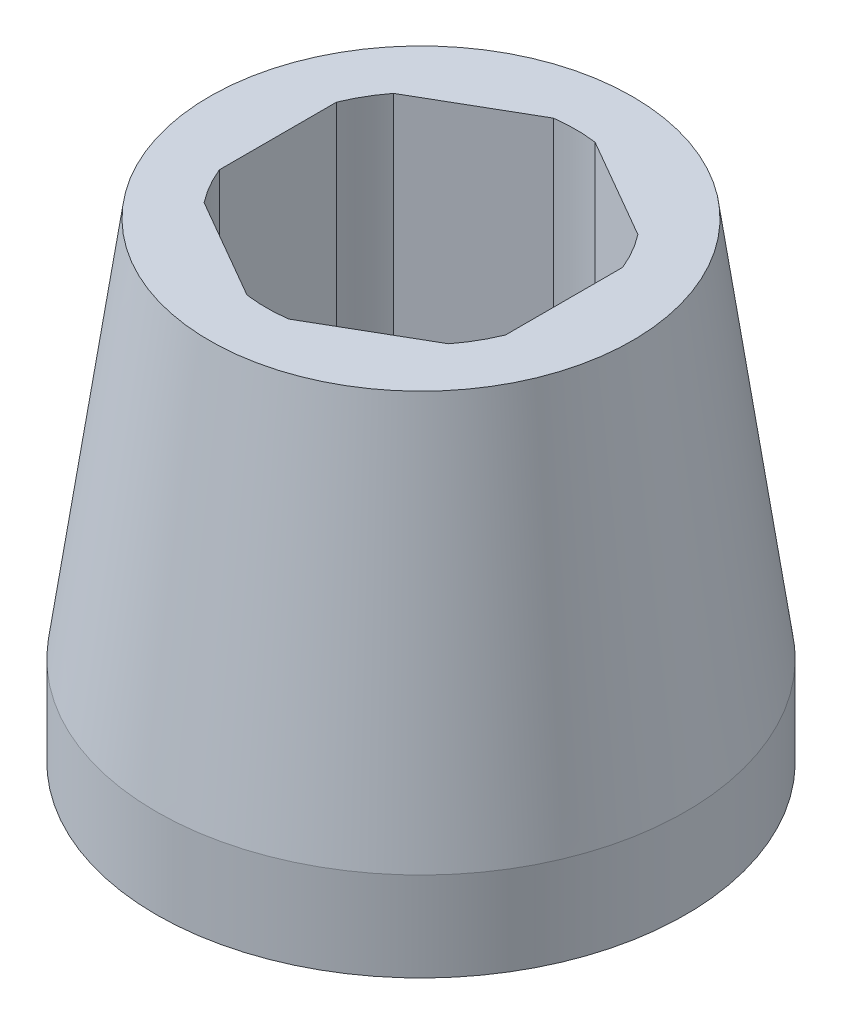
ISO-10303-21;
HEADER;
FILE_DESCRIPTION(('STEP AP214'),'2;1');
FILE_NAME('part.step','',(''),(''),'','','');
FILE_SCHEMA(('AUTOMOTIVE_DESIGN { 1 0 10303 214 1 1 1 1 }'));
ENDSEC;
DATA;
#1=APPLICATION_CONTEXT('core data for automotive mechanical design processes');
#2=APPLICATION_PROTOCOL_DEFINITION('international standard','automotive_design',2000,#1);
#3=PRODUCT_CONTEXT('',#1,'mechanical');
#4=PRODUCT('Part','Part','',(#3));
#5=PRODUCT_RELATED_PRODUCT_CATEGORY('part','',(#4));
#6=PRODUCT_DEFINITION_FORMATION('','',#4);
#7=PRODUCT_DEFINITION_CONTEXT('part definition',#1,'design');
#8=PRODUCT_DEFINITION('design','',#6,#7);
#9=PRODUCT_DEFINITION_SHAPE('','',#8);
#10=(LENGTH_UNIT() NAMED_UNIT(*) SI_UNIT(.MILLI.,.METRE.));
#11=(NAMED_UNIT(*) PLANE_ANGLE_UNIT() SI_UNIT($,.RADIAN.));
#12=(NAMED_UNIT(*) SI_UNIT($,.STERADIAN.) SOLID_ANGLE_UNIT());
#13=UNCERTAINTY_MEASURE_WITH_UNIT(LENGTH_MEASURE(1.E-05),#10,'distance_accuracy_value','');
#14=(GEOMETRIC_REPRESENTATION_CONTEXT(3) GLOBAL_UNCERTAINTY_ASSIGNED_CONTEXT((#13)) GLOBAL_UNIT_ASSIGNED_CONTEXT((#10,
#11,#12)) REPRESENTATION_CONTEXT('',''));
#15=CARTESIAN_POINT('',(0.,0.,0.));
#16=DIRECTION('',(0.,0.,1.));
#17=DIRECTION('',(1.,0.,0.));
#18=AXIS2_PLACEMENT_3D('',#15,#16,#17);
#19=CARTESIAN_POINT('',(0.,0.,0.));
#20=DIRECTION('',(0.,-1.,0.));
#21=DIRECTION('',(0.,0.,-1.));
#22=AXIS2_PLACEMENT_3D('',#19,#20,#21);
#23=CYLINDRICAL_SURFACE('',#22,5.2);
#24=CARTESIAN_POINT('',(0.,15.829,0.));
#25=DIRECTION('',(0.,-1.,0.));
#26=DIRECTION('',(0.,0.,-1.));
#27=AXIS2_PLACEMENT_3D('',#24,#25,#26);
#28=CIRCLE('',#27,5.2);
#29=CARTESIAN_POINT('',(0.700412137687176,15.829,5.15261320471278));
#30=VERTEX_POINT('',#29);
#31=CARTESIAN_POINT('',(-0.700412137687167,15.829,5.15261320471278));
#32=VERTEX_POINT('',#31);
#33=EDGE_CURVE('E153',#30,#32,#28,.T.);
#34=ORIENTED_EDGE('',*,*,#33,.F.);
#35=DIRECTION('',(0.,-1.,0.));
#36=VECTOR('',#35,1.);
#37=CARTESIAN_POINT('',(0.700412137687176,19.7874758746265,5.15261320471278));
#38=LINE('',#37,#36);
#39=CARTESIAN_POINT('',(0.700412137687176,4.953,5.15261320471278));
#40=VERTEX_POINT('',#39);
#41=EDGE_CURVE('E140',#30,#40,#38,.T.);
#42=ORIENTED_EDGE('',*,*,#41,.T.);
#43=CARTESIAN_POINT('',(0.,4.953,0.));
#44=DIRECTION('',(0.,-1.,0.));
#45=DIRECTION('',(0.,0.,-1.));
#46=AXIS2_PLACEMENT_3D('',#43,#44,#45);
#47=CIRCLE('',#46,5.2);
#48=CARTESIAN_POINT('',(-0.700412137687167,4.953,5.15261320471278));
#49=VERTEX_POINT('',#48);
#50=EDGE_CURVE('E151',#40,#49,#47,.T.);
#51=ORIENTED_EDGE('',*,*,#50,.T.);
#52=DIRECTION('',(0.,-1.,0.));
#53=VECTOR('',#52,1.);
#54=CARTESIAN_POINT('',(-0.700412137687167,19.7874758746265,5.15261320471278));
#55=LINE('',#54,#53);
#56=EDGE_CURVE('E229',#32,#49,#55,.T.);
#57=ORIENTED_EDGE('',*,*,#56,.F.);
#58=EDGE_LOOP('',(#34,#42,#51,#57));
#59=FACE_BOUND('',#58,.T.);
#60=ADVANCED_FACE('F49',(#59),#23,.F.);
#61=CARTESIAN_POINT('',(4.8125,4.953,1.96973189800033));
#62=VERTEX_POINT('',#61);
#63=CARTESIAN_POINT('',(4.11208786231283,4.953,3.18288130671244));
#64=VERTEX_POINT('',#63);
#65=EDGE_CURVE('E159',#62,#64,#47,.T.);
#66=ORIENTED_EDGE('',*,*,#65,.T.);
#67=DIRECTION('',(0.,-1.,0.));
#68=VECTOR('',#67,1.);
#69=CARTESIAN_POINT('',(4.11208786231283,19.7874758746265,3.18288130671244));
#70=LINE('',#69,#68);
#71=CARTESIAN_POINT('',(4.11208786231283,15.829,3.18288130671244));
#72=VERTEX_POINT('',#71);
#73=EDGE_CURVE('E143',#72,#64,#70,.T.);
#74=ORIENTED_EDGE('',*,*,#73,.F.);
#75=CARTESIAN_POINT('',(4.8125,15.829,1.96973189800033));
#76=VERTEX_POINT('',#75);
#77=EDGE_CURVE('E248',#76,#72,#28,.T.);
#78=ORIENTED_EDGE('',*,*,#77,.F.);
#79=DIRECTION('',(0.,-1.,0.));
#80=VECTOR('',#79,1.);
#81=CARTESIAN_POINT('',(4.8125,19.7874758746265,1.96973189800033));
#82=LINE('',#81,#80);
#83=EDGE_CURVE('E202',#76,#62,#82,.T.);
#84=ORIENTED_EDGE('',*,*,#83,.T.);
#85=EDGE_LOOP('',(#66,#74,#78,#84));
#86=FACE_BOUND('',#85,.T.);
#87=ADVANCED_FACE('F286',(#86),#23,.F.);
#88=CARTESIAN_POINT('',(4.11208786231283,4.953,-3.18288130671244));
#89=VERTEX_POINT('',#88);
#90=CARTESIAN_POINT('',(4.8125,4.953,-1.96973189800033));
#91=VERTEX_POINT('',#90);
#92=EDGE_CURVE('E163',#89,#91,#47,.T.);
#93=ORIENTED_EDGE('',*,*,#92,.T.);
#94=DIRECTION('',(0.,-1.,0.));
#95=VECTOR('',#94,1.);
#96=CARTESIAN_POINT('',(4.8125,19.7874758746265,-1.96973189800033));
#97=LINE('',#96,#95);
#98=CARTESIAN_POINT('',(4.8125,15.829,-1.96973189800033));
#99=VERTEX_POINT('',#98);
#100=EDGE_CURVE('E193',#99,#91,#97,.T.);
#101=ORIENTED_EDGE('',*,*,#100,.F.);
#102=CARTESIAN_POINT('',(4.11208786231283,15.829,-3.18288130671244));
#103=VERTEX_POINT('',#102);
#104=EDGE_CURVE('E250',#103,#99,#28,.T.);
#105=ORIENTED_EDGE('',*,*,#104,.F.);
#106=DIRECTION('',(0.,-1.,0.));
#107=VECTOR('',#106,1.);
#108=CARTESIAN_POINT('',(4.11208786231283,19.7874758746265,-3.18288130671244));
#109=LINE('',#108,#107);
#110=EDGE_CURVE('E195',#103,#89,#109,.T.);
#111=ORIENTED_EDGE('',*,*,#110,.T.);
#112=EDGE_LOOP('',(#93,#101,#105,#111));
#113=FACE_BOUND('',#112,.T.);
#114=ADVANCED_FACE('F191',(#113),#23,.F.);
#115=CARTESIAN_POINT('',(-0.700412137687172,4.953,-5.15261320471278));
#116=VERTEX_POINT('',#115);
#117=CARTESIAN_POINT('',(0.700412137687175,4.953,-5.15261320471278));
#118=VERTEX_POINT('',#117);
#119=EDGE_CURVE('E176',#116,#118,#47,.T.);
#120=ORIENTED_EDGE('',*,*,#119,.T.);
#121=DIRECTION('',(0.,-1.,0.));
#122=VECTOR('',#121,1.);
#123=CARTESIAN_POINT('',(0.700412137687175,19.7874758746265,-5.15261320471278));
#124=LINE('',#123,#122);
#125=CARTESIAN_POINT('',(0.700412137687175,15.829,-5.15261320471278));
#126=VERTEX_POINT('',#125);
#127=EDGE_CURVE('E208',#126,#118,#124,.T.);
#128=ORIENTED_EDGE('',*,*,#127,.F.);
#129=CARTESIAN_POINT('',(-0.700412137687172,15.829,-5.15261320471278));
#130=VERTEX_POINT('',#129);
#131=EDGE_CURVE('E252',#130,#126,#28,.T.);
#132=ORIENTED_EDGE('',*,*,#131,.F.);
#133=DIRECTION('',(0.,-1.,0.));
#134=VECTOR('',#133,1.);
#135=CARTESIAN_POINT('',(-0.700412137687172,19.7874758746265,-5.15261320471278));
#136=LINE('',#135,#134);
#137=EDGE_CURVE('E218',#130,#116,#136,.T.);
#138=ORIENTED_EDGE('',*,*,#137,.T.);
#139=EDGE_LOOP('',(#120,#128,#132,#138));
#140=FACE_BOUND('',#139,.T.);
#141=ADVANCED_FACE('F303',(#140),#23,.F.);
#142=CARTESIAN_POINT('',(-4.8125,4.953,-1.96973189800034));
#143=VERTEX_POINT('',#142);
#144=CARTESIAN_POINT('',(-4.11208786231283,4.953,-3.18288130671244));
#145=VERTEX_POINT('',#144);
#146=EDGE_CURVE('E170',#143,#145,#47,.T.);
#147=ORIENTED_EDGE('',*,*,#146,.T.);
#148=DIRECTION('',(0.,-1.,0.));
#149=VECTOR('',#148,1.);
#150=CARTESIAN_POINT('',(-4.11208786231283,19.7874758746265,-3.18288130671244));
#151=LINE('',#150,#149);
#152=CARTESIAN_POINT('',(-4.11208786231283,15.829,-3.18288130671244));
#153=VERTEX_POINT('',#152);
#154=EDGE_CURVE('E213',#153,#145,#151,.T.);
#155=ORIENTED_EDGE('',*,*,#154,.F.);
#156=CARTESIAN_POINT('',(-4.8125,15.829,-1.96973189800034));
#157=VERTEX_POINT('',#156);
#158=EDGE_CURVE('E165',#157,#153,#28,.T.);
#159=ORIENTED_EDGE('',*,*,#158,.F.);
#160=DIRECTION('',(0.,-1.,0.));
#161=VECTOR('',#160,1.);
#162=CARTESIAN_POINT('',(-4.8125,19.7874758746265,-1.96973189800034));
#163=LINE('',#162,#161);
#164=EDGE_CURVE('E226',#157,#143,#163,.T.);
#165=ORIENTED_EDGE('',*,*,#164,.T.);
#166=EDGE_LOOP('',(#147,#155,#159,#165));
#167=FACE_BOUND('',#166,.T.);
#168=ADVANCED_FACE('F261',(#167),#23,.F.);
#169=CARTESIAN_POINT('',(-4.11208786231283,4.953,3.18288130671244));
#170=VERTEX_POINT('',#169);
#171=CARTESIAN_POINT('',(-4.8125,4.953,1.96973189800034));
#172=VERTEX_POINT('',#171);
#173=EDGE_CURVE('E162',#170,#172,#47,.T.);
#174=ORIENTED_EDGE('',*,*,#173,.T.);
#175=DIRECTION('',(0.,-1.,0.));
#176=VECTOR('',#175,1.);
#177=CARTESIAN_POINT('',(-4.8125,19.7874758746265,1.96973189800034));
#178=LINE('',#177,#176);
#179=CARTESIAN_POINT('',(-4.8125,15.829,1.96973189800034));
#180=VERTEX_POINT('',#179);
#181=EDGE_CURVE('E221',#180,#172,#178,.T.);
#182=ORIENTED_EDGE('',*,*,#181,.F.);
#183=CARTESIAN_POINT('',(-4.11208786231283,15.829,3.18288130671244));
#184=VERTEX_POINT('',#183);
#185=EDGE_CURVE('E160',#184,#180,#28,.T.);
#186=ORIENTED_EDGE('',*,*,#185,.F.);
#187=DIRECTION('',(0.,-1.,0.));
#188=VECTOR('',#187,1.);
#189=CARTESIAN_POINT('',(-4.11208786231283,19.7874758746265,3.18288130671244));
#190=LINE('',#189,#188);
#191=EDGE_CURVE('E233',#184,#170,#190,.T.);
#192=ORIENTED_EDGE('',*,*,#191,.T.);
#193=EDGE_LOOP('',(#174,#182,#186,#192));
#194=FACE_BOUND('',#193,.T.);
#195=ADVANCED_FACE('F269',(#194),#23,.F.);
#196=CARTESIAN_POINT('',(8.9,0.,0.));
#197=DIRECTION('',(0.,-1.,0.));
#198=DIRECTION('',(0.,0.,-1.));
#199=AXIS2_PLACEMENT_3D('',#196,#197,#198);
#200=PLANE('',#199);
#201=CARTESIAN_POINT('',(0.,0.,0.));
#202=DIRECTION('',(0.,-1.,0.));
#203=DIRECTION('',(0.,0.,-1.));
#204=AXIS2_PLACEMENT_3D('',#201,#202,#203);
#205=CIRCLE('',#204,7.55);
#206=CARTESIAN_POINT('',(0.,0.,-7.55));
#207=VERTEX_POINT('',#206);
#208=EDGE_CURVE('E11',#207,#207,#205,.F.);
#209=ORIENTED_EDGE('',*,*,#208,.T.);
#210=EDGE_LOOP('',(#209));
#211=FACE_BOUND('',#210,.T.);
#212=CARTESIAN_POINT('',(0.,0.,0.));
#213=DIRECTION('',(0.,-1.,0.));
#214=DIRECTION('',(0.,0.,-1.));
#215=AXIS2_PLACEMENT_3D('',#212,#213,#214);
#216=CIRCLE('',#215,8.9);
#217=CARTESIAN_POINT('',(0.,0.,-8.9));
#218=VERTEX_POINT('',#217);
#219=EDGE_CURVE('E236',#218,#218,#216,.T.);
#220=ORIENTED_EDGE('',*,*,#219,.T.);
#221=EDGE_LOOP('',(#220));
#222=FACE_BOUND('',#221,.T.);
#223=ADVANCED_FACE('F295',(#211,#222),#200,.T.);
#224=CARTESIAN_POINT('',(0.,0.,0.));
#225=DIRECTION('',(0.,-1.,0.));
#226=DIRECTION('',(0.,0.,-1.));
#227=AXIS2_PLACEMENT_3D('',#224,#225,#226);
#228=CYLINDRICAL_SURFACE('',#227,6.8);
#229=CARTESIAN_POINT('',(0.,0.750000000000002,0.));
#230=DIRECTION('',(0.,-1.,0.));
#231=DIRECTION('',(0.,0.,-1.));
#232=AXIS2_PLACEMENT_3D('',#229,#230,#231);
#233=CIRCLE('',#232,6.8);
#234=CARTESIAN_POINT('',(0.,0.750000000000002,-6.8));
#235=VERTEX_POINT('',#234);
#236=EDGE_CURVE('E58',#235,#235,#233,.T.);
#237=ORIENTED_EDGE('',*,*,#236,.T.);
#238=EDGE_LOOP('',(#237));
#239=FACE_BOUND('',#238,.T.);
#240=CARTESIAN_POINT('',(0.,4.953,0.));
#241=DIRECTION('',(0.,-1.,0.));
#242=DIRECTION('',(0.,0.,-1.));
#243=AXIS2_PLACEMENT_3D('',#240,#241,#242);
#244=CIRCLE('',#243,6.8);
#245=CARTESIAN_POINT('',(0.,4.953,-6.8));
#246=VERTEX_POINT('',#245);
#247=EDGE_CURVE('E169',#246,#246,#244,.T.);
#248=ORIENTED_EDGE('',*,*,#247,.F.);
#249=EDGE_LOOP('',(#248));
#250=FACE_BOUND('',#249,.T.);
#251=ADVANCED_FACE('F301',(#239,#250),#228,.F.);
#252=CARTESIAN_POINT('',(6.8,4.953,0.));
#253=DIRECTION('',(0.,-1.,0.));
#254=DIRECTION('',(0.,0.,-1.));
#255=AXIS2_PLACEMENT_3D('',#252,#253,#254);
#256=PLANE('',#255);
#257=ORIENTED_EDGE('',*,*,#247,.T.);
#258=EDGE_LOOP('',(#257));
#259=FACE_BOUND('',#258,.T.);
#260=ORIENTED_EDGE('',*,*,#173,.F.);
#261=DIRECTION('',(-0.866025403784438,0.,-0.5));
#262=VECTOR('',#261,1.);
#263=CARTESIAN_POINT('',(-2.40625,4.953,4.16774725571261));
#264=LINE('',#263,#262);
#265=EDGE_CURVE('E158',#49,#170,#264,.T.);
#266=ORIENTED_EDGE('',*,*,#265,.F.);
#267=ORIENTED_EDGE('',*,*,#50,.F.);
#268=DIRECTION('',(-0.866025403784438,0.,0.5));
#269=VECTOR('',#268,1.);
#270=CARTESIAN_POINT('',(2.40625,4.953,4.16774725571261));
#271=LINE('',#270,#269);
#272=EDGE_CURVE('E137',#64,#40,#271,.T.);
#273=ORIENTED_EDGE('',*,*,#272,.F.);
#274=ORIENTED_EDGE('',*,*,#65,.F.);
#275=DIRECTION('',(0.,0.,1.));
#276=VECTOR('',#275,1.);
#277=CARTESIAN_POINT('',(4.8125,4.953,0.));
#278=LINE('',#277,#276);
#279=EDGE_CURVE('E199',#91,#62,#278,.T.);
#280=ORIENTED_EDGE('',*,*,#279,.F.);
#281=ORIENTED_EDGE('',*,*,#92,.F.);
#282=DIRECTION('',(0.866025403784439,0.,0.5));
#283=VECTOR('',#282,1.);
#284=CARTESIAN_POINT('',(2.40625,4.953,-4.16774725571261));
#285=LINE('',#284,#283);
#286=EDGE_CURVE('E198',#118,#89,#285,.T.);
#287=ORIENTED_EDGE('',*,*,#286,.F.);
#288=ORIENTED_EDGE('',*,*,#119,.F.);
#289=DIRECTION('',(0.866025403784439,0.,-0.5));
#290=VECTOR('',#289,1.);
#291=CARTESIAN_POINT('',(-2.40625,4.953,-4.16774725571261));
#292=LINE('',#291,#290);
#293=EDGE_CURVE('E216',#145,#116,#292,.T.);
#294=ORIENTED_EDGE('',*,*,#293,.F.);
#295=ORIENTED_EDGE('',*,*,#146,.F.);
#296=DIRECTION('',(0.,0.,-1.));
#297=VECTOR('',#296,1.);
#298=CARTESIAN_POINT('',(-4.8125,4.953,0.));
#299=LINE('',#298,#297);
#300=EDGE_CURVE('E224',#172,#143,#299,.T.);
#301=ORIENTED_EDGE('',*,*,#300,.F.);
#302=EDGE_LOOP('',(#260,#266,#267,#273,#274,#280,#281,#287,#288,#294,#295,#301));
#303=FACE_BOUND('',#302,.T.);
#304=ADVANCED_FACE('F157',(#259,#303),#256,.T.);
#305=CARTESIAN_POINT('',(5.2,15.829,0.));
#306=DIRECTION('',(0.,1.,0.));
#307=DIRECTION('',(0.,0.,1.));
#308=AXIS2_PLACEMENT_3D('',#305,#306,#307);
#309=PLANE('',#308);
#310=ORIENTED_EDGE('',*,*,#185,.T.);
#311=DIRECTION('',(0.,0.,-1.));
#312=VECTOR('',#311,1.);
#313=CARTESIAN_POINT('',(-4.8125,15.829,0.));
#314=LINE('',#313,#312);
#315=EDGE_CURVE('E227',#180,#157,#314,.T.);
#316=ORIENTED_EDGE('',*,*,#315,.T.);
#317=ORIENTED_EDGE('',*,*,#158,.T.);
#318=DIRECTION('',(0.866025403784439,0.,-0.5));
#319=VECTOR('',#318,1.);
#320=CARTESIAN_POINT('',(-2.40625,15.829,-4.16774725571261));
#321=LINE('',#320,#319);
#322=EDGE_CURVE('E219',#153,#130,#321,.T.);
#323=ORIENTED_EDGE('',*,*,#322,.T.);
#324=ORIENTED_EDGE('',*,*,#131,.T.);
#325=DIRECTION('',(0.866025403784439,0.,0.5));
#326=VECTOR('',#325,1.);
#327=CARTESIAN_POINT('',(2.40625,15.829,-4.16774725571261));
#328=LINE('',#327,#326);
#329=EDGE_CURVE('E211',#126,#103,#328,.T.);
#330=ORIENTED_EDGE('',*,*,#329,.T.);
#331=ORIENTED_EDGE('',*,*,#104,.T.);
#332=DIRECTION('',(0.,0.,1.));
#333=VECTOR('',#332,1.);
#334=CARTESIAN_POINT('',(4.8125,15.829,0.));
#335=LINE('',#334,#333);
#336=EDGE_CURVE('E71',#99,#76,#335,.T.);
#337=ORIENTED_EDGE('',*,*,#336,.T.);
#338=ORIENTED_EDGE('',*,*,#77,.T.);
#339=DIRECTION('',(-0.866025403784439,0.,0.5));
#340=VECTOR('',#339,1.);
#341=CARTESIAN_POINT('',(2.40625,15.829,4.16774725571261));
#342=LINE('',#341,#340);
#343=EDGE_CURVE('E65',#72,#30,#342,.T.);
#344=ORIENTED_EDGE('',*,*,#343,.T.);
#345=ORIENTED_EDGE('',*,*,#33,.T.);
#346=DIRECTION('',(-0.866025403784439,0.,-0.5));
#347=VECTOR('',#346,1.);
#348=CARTESIAN_POINT('',(-2.40625,15.829,4.16774725571261));
#349=LINE('',#348,#347);
#350=EDGE_CURVE('E234',#32,#184,#349,.T.);
#351=ORIENTED_EDGE('',*,*,#350,.T.);
#352=EDGE_LOOP('',(#310,#316,#317,#323,#324,#330,#331,#337,#338,#344,#345,#351));
#353=FACE_BOUND('',#352,.T.);
#354=CARTESIAN_POINT('',(0.,15.829,0.));
#355=DIRECTION('',(0.,-1.,0.));
#356=DIRECTION('',(0.,0.,-1.));
#357=AXIS2_PLACEMENT_3D('',#354,#355,#356);
#358=CIRCLE('',#357,7.112);
#359=CARTESIAN_POINT('',(0.,15.829,-7.112));
#360=VERTEX_POINT('',#359);
#361=EDGE_CURVE('E244',#360,#360,#358,.T.);
#362=ORIENTED_EDGE('',*,*,#361,.F.);
#363=EDGE_LOOP('',(#362));
#364=FACE_BOUND('',#363,.T.);
#365=ADVANCED_FACE('F257',(#353,#364),#309,.T.);
#366=CARTESIAN_POINT('',(0.,3.,0.));
#367=DIRECTION('',(0.,-1.,0.));
#368=DIRECTION('',(0.,0.,-1.));
#369=AXIS2_PLACEMENT_3D('',#366,#367,#368);
#370=CONICAL_SURFACE('',#369,8.9,0.138479701572066);
#371=ORIENTED_EDGE('',*,*,#361,.T.);
#372=EDGE_LOOP('',(#371));
#373=FACE_BOUND('',#372,.T.);
#374=CARTESIAN_POINT('',(0.,3.,0.));
#375=DIRECTION('',(0.,-1.,0.));
#376=DIRECTION('',(0.,0.,-1.));
#377=AXIS2_PLACEMENT_3D('',#374,#375,#376);
#378=CIRCLE('',#377,8.9);
#379=CARTESIAN_POINT('',(0.,3.,-8.9));
#380=VERTEX_POINT('',#379);
#381=EDGE_CURVE('E241',#380,#380,#378,.T.);
#382=ORIENTED_EDGE('',*,*,#381,.F.);
#383=EDGE_LOOP('',(#382));
#384=FACE_BOUND('',#383,.T.);
#385=ADVANCED_FACE('F282',(#373,#384),#370,.T.);
#386=CARTESIAN_POINT('',(0.,0.,0.));
#387=DIRECTION('',(0.,-1.,0.));
#388=DIRECTION('',(0.,0.,-1.));
#389=AXIS2_PLACEMENT_3D('',#386,#387,#388);
#390=CYLINDRICAL_SURFACE('',#389,8.9);
#391=ORIENTED_EDGE('',*,*,#381,.T.);
#392=EDGE_LOOP('',(#391));
#393=FACE_BOUND('',#392,.T.);
#394=ORIENTED_EDGE('',*,*,#219,.F.);
#395=EDGE_LOOP('',(#394));
#396=FACE_BOUND('',#395,.T.);
#397=ADVANCED_FACE('F274',(#393,#396),#390,.T.);
#398=CARTESIAN_POINT('',(-2.40625,19.7874758746265,4.16774725571261));
#399=DIRECTION('',(-0.5,0.,0.866025403784438));
#400=DIRECTION('',(0.866025403784439,0.,0.5));
#401=AXIS2_PLACEMENT_3D('',#398,#399,#400);
#402=PLANE('',#401);
#403=ORIENTED_EDGE('',*,*,#350,.F.);
#404=ORIENTED_EDGE('',*,*,#56,.T.);
#405=ORIENTED_EDGE('',*,*,#265,.T.);
#406=ORIENTED_EDGE('',*,*,#191,.F.);
#407=EDGE_LOOP('',(#403,#404,#405,#406));
#408=FACE_BOUND('',#407,.T.);
#409=ADVANCED_FACE('F272',(#408),#402,.F.);
#410=CARTESIAN_POINT('',(-4.8125,19.7874758746265,0.));
#411=DIRECTION('',(-1.,0.,0.));
#412=DIRECTION('',(0.,0.,1.));
#413=AXIS2_PLACEMENT_3D('',#410,#411,#412);
#414=PLANE('',#413);
#415=ORIENTED_EDGE('',*,*,#315,.F.);
#416=ORIENTED_EDGE('',*,*,#181,.T.);
#417=ORIENTED_EDGE('',*,*,#300,.T.);
#418=ORIENTED_EDGE('',*,*,#164,.F.);
#419=EDGE_LOOP('',(#415,#416,#417,#418));
#420=FACE_BOUND('',#419,.T.);
#421=ADVANCED_FACE('F267',(#420),#414,.F.);
#422=CARTESIAN_POINT('',(-2.40625,19.7874758746265,-4.16774725571261));
#423=DIRECTION('',(-0.5,0.,-0.866025403784439));
#424=DIRECTION('',(-0.866025403784439,0.,0.5));
#425=AXIS2_PLACEMENT_3D('',#422,#423,#424);
#426=PLANE('',#425);
#427=ORIENTED_EDGE('',*,*,#322,.F.);
#428=ORIENTED_EDGE('',*,*,#154,.T.);
#429=ORIENTED_EDGE('',*,*,#293,.T.);
#430=ORIENTED_EDGE('',*,*,#137,.F.);
#431=EDGE_LOOP('',(#427,#428,#429,#430));
#432=FACE_BOUND('',#431,.T.);
#433=ADVANCED_FACE('F264',(#432),#426,.F.);
#434=CARTESIAN_POINT('',(2.40625,19.7874758746265,-4.16774725571261));
#435=DIRECTION('',(0.5,0.,-0.866025403784439));
#436=DIRECTION('',(-0.866025403784439,0.,-0.5));
#437=AXIS2_PLACEMENT_3D('',#434,#435,#436);
#438=PLANE('',#437);
#439=ORIENTED_EDGE('',*,*,#329,.F.);
#440=ORIENTED_EDGE('',*,*,#127,.T.);
#441=ORIENTED_EDGE('',*,*,#286,.T.);
#442=ORIENTED_EDGE('',*,*,#110,.F.);
#443=EDGE_LOOP('',(#439,#440,#441,#442));
#444=FACE_BOUND('',#443,.T.);
#445=ADVANCED_FACE('F392',(#444),#438,.F.);
#446=CARTESIAN_POINT('',(4.8125,19.7874758746265,0.));
#447=DIRECTION('',(1.,0.,0.));
#448=DIRECTION('',(0.,0.,-1.));
#449=AXIS2_PLACEMENT_3D('',#446,#447,#448);
#450=PLANE('',#449);
#451=ORIENTED_EDGE('',*,*,#336,.F.);
#452=ORIENTED_EDGE('',*,*,#100,.T.);
#453=ORIENTED_EDGE('',*,*,#279,.T.);
#454=ORIENTED_EDGE('',*,*,#83,.F.);
#455=EDGE_LOOP('',(#451,#452,#453,#454));
#456=FACE_BOUND('',#455,.T.);
#457=ADVANCED_FACE('F401',(#456),#450,.F.);
#458=CARTESIAN_POINT('',(2.40625,19.7874758746265,4.16774725571261));
#459=DIRECTION('',(0.5,0.,0.866025403784438));
#460=DIRECTION('',(0.866025403784439,0.,-0.5));
#461=AXIS2_PLACEMENT_3D('',#458,#459,#460);
#462=PLANE('',#461);
#463=ORIENTED_EDGE('',*,*,#343,.F.);
#464=ORIENTED_EDGE('',*,*,#73,.T.);
#465=ORIENTED_EDGE('',*,*,#272,.T.);
#466=ORIENTED_EDGE('',*,*,#41,.F.);
#467=EDGE_LOOP('',(#463,#464,#465,#466));
#468=FACE_BOUND('',#467,.T.);
#469=ADVANCED_FACE('F139',(#468),#462,.F.);
#470=CARTESIAN_POINT('',(0.,0.750000000000002,0.));
#471=DIRECTION('',(0.,-1.,0.));
#472=DIRECTION('',(0.,0.,-1.));
#473=AXIS2_PLACEMENT_3D('',#470,#471,#472);
#474=CONICAL_SURFACE('',#473,6.8,0.785398163397449);
#475=ORIENTED_EDGE('',*,*,#208,.F.);
#476=EDGE_LOOP('',(#475));
#477=FACE_BOUND('',#476,.T.);
#478=ORIENTED_EDGE('',*,*,#236,.F.);
#479=EDGE_LOOP('',(#478));
#480=FACE_BOUND('',#479,.T.);
#481=ADVANCED_FACE('F52',(#477,#480),#474,.F.);
#482=CLOSED_SHELL('',(#60,#87,#114,#141,#168,#195,#223,#251,#304,#365,#385,#397,#409,#421,#433,
#445,#457,#469,#481));
#483=MANIFOLD_SOLID_BREP('B2',#482);
#484=ADVANCED_BREP_SHAPE_REPRESENTATION('',(#18,#483),#14);
#485=SHAPE_DEFINITION_REPRESENTATION(#9,#484);
ENDSEC;
END-ISO-10303-21;
